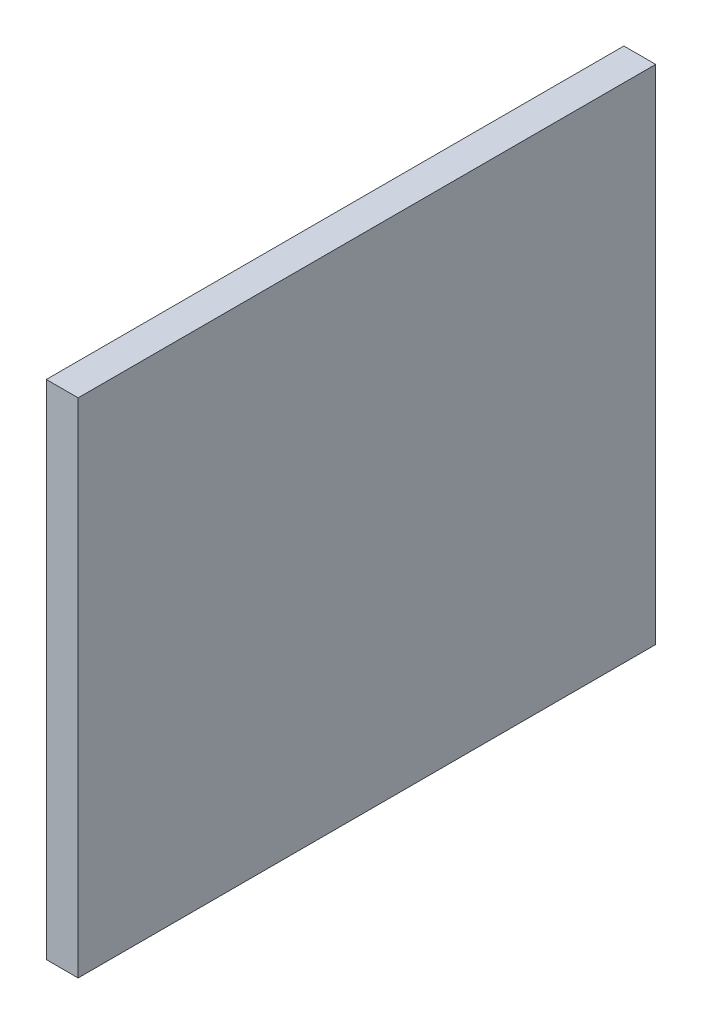
ISO-10303-21;
HEADER;
FILE_DESCRIPTION(('STEP AP214'),'2;1');
FILE_NAME('part.step','',(''),(''),'','','');
FILE_SCHEMA(('AUTOMOTIVE_DESIGN { 1 0 10303 214 1 1 1 1 }'));
ENDSEC;
DATA;
#1=APPLICATION_CONTEXT('core data for automotive mechanical design processes');
#2=APPLICATION_PROTOCOL_DEFINITION('international standard','automotive_design',2000,#1);
#3=PRODUCT_CONTEXT('',#1,'mechanical');
#4=PRODUCT('Part','Part','',(#3));
#5=PRODUCT_RELATED_PRODUCT_CATEGORY('part','',(#4));
#6=PRODUCT_DEFINITION_FORMATION('','',#4);
#7=PRODUCT_DEFINITION_CONTEXT('part definition',#1,'design');
#8=PRODUCT_DEFINITION('design','',#6,#7);
#9=PRODUCT_DEFINITION_SHAPE('','',#8);
#10=(LENGTH_UNIT() NAMED_UNIT(*) SI_UNIT(.MILLI.,.METRE.));
#11=(NAMED_UNIT(*) PLANE_ANGLE_UNIT() SI_UNIT($,.RADIAN.));
#12=(NAMED_UNIT(*) SI_UNIT($,.STERADIAN.) SOLID_ANGLE_UNIT());
#13=UNCERTAINTY_MEASURE_WITH_UNIT(LENGTH_MEASURE(1.E-05),#10,'distance_accuracy_value','');
#14=(GEOMETRIC_REPRESENTATION_CONTEXT(3) GLOBAL_UNCERTAINTY_ASSIGNED_CONTEXT((#13)) GLOBAL_UNIT_ASSIGNED_CONTEXT((#10,
#11,#12)) REPRESENTATION_CONTEXT('',''));
#15=CARTESIAN_POINT('',(0.,0.,0.));
#16=DIRECTION('',(0.,0.,1.));
#17=DIRECTION('',(1.,0.,0.));
#18=AXIS2_PLACEMENT_3D('',#15,#16,#17);
#19=CARTESIAN_POINT('',(7621.97362852035,3360.56913960241,57.6072));
#20=DIRECTION('',(0.,-1.,0.));
#21=DIRECTION('',(0.,0.,-1.));
#22=AXIS2_PLACEMENT_3D('',#19,#20,#21);
#23=PLANE('',#22);
#24=DIRECTION('',(-1.,0.,0.));
#25=VECTOR('',#24,1.);
#26=CARTESIAN_POINT('',(7621.97362852035,3360.56913960241,0.));
#27=LINE('',#26,#25);
#28=CARTESIAN_POINT('',(7625.14862852035,3360.56913960241,0.));
#29=VERTEX_POINT('',#28);
#30=CARTESIAN_POINT('',(7621.97362852035,3360.56913960241,0.));
#31=VERTEX_POINT('',#30);
#32=EDGE_CURVE('E96',#29,#31,#27,.T.);
#33=ORIENTED_EDGE('',*,*,#32,.T.);
#34=DIRECTION('',(0.,0.,-1.));
#35=VECTOR('',#34,1.);
#36=CARTESIAN_POINT('',(7621.97362852035,3360.56913960241,57.6072));
#37=LINE('',#36,#35);
#38=CARTESIAN_POINT('',(7621.97362852035,3360.56913960241,57.6072));
#39=VERTEX_POINT('',#38);
#40=EDGE_CURVE('E11',#39,#31,#37,.T.);
#41=ORIENTED_EDGE('',*,*,#40,.F.);
#42=DIRECTION('',(-1.,0.,0.));
#43=VECTOR('',#42,1.);
#44=CARTESIAN_POINT('',(7621.97362852035,3360.56913960241,57.6072));
#45=LINE('',#44,#43);
#46=CARTESIAN_POINT('',(7625.14862852035,3360.56913960241,57.6072));
#47=VERTEX_POINT('',#46);
#48=EDGE_CURVE('E84',#47,#39,#45,.T.);
#49=ORIENTED_EDGE('',*,*,#48,.F.);
#50=DIRECTION('',(0.,0.,-1.));
#51=VECTOR('',#50,1.);
#52=CARTESIAN_POINT('',(7625.14862852035,3360.56913960241,57.6072));
#53=LINE('',#52,#51);
#54=EDGE_CURVE('E92',#47,#29,#53,.T.);
#55=ORIENTED_EDGE('',*,*,#54,.T.);
#56=EDGE_LOOP('',(#33,#41,#49,#55));
#57=FACE_BOUND('',#56,.T.);
#58=ADVANCED_FACE('F33',(#57),#23,.F.);
#59=CARTESIAN_POINT('',(7621.97362852035,3360.56913960241,57.6072));
#60=DIRECTION('',(1.,0.,0.));
#61=DIRECTION('',(0.,0.,-1.));
#62=AXIS2_PLACEMENT_3D('',#59,#60,#61);
#63=PLANE('',#62);
#64=DIRECTION('',(0.,-1.,0.));
#65=VECTOR('',#64,1.);
#66=CARTESIAN_POINT('',(7621.97362852035,3360.56913960241,0.));
#67=LINE('',#66,#65);
#68=CARTESIAN_POINT('',(7621.97362852035,3310.45493960241,0.));
#69=VERTEX_POINT('',#68);
#70=EDGE_CURVE('E88',#31,#69,#67,.T.);
#71=ORIENTED_EDGE('',*,*,#70,.T.);
#72=DIRECTION('',(0.,0.,-1.));
#73=VECTOR('',#72,1.);
#74=CARTESIAN_POINT('',(7621.97362852035,3310.45493960241,57.6072));
#75=LINE('',#74,#73);
#76=CARTESIAN_POINT('',(7621.97362852035,3310.45493960241,57.6072));
#77=VERTEX_POINT('',#76);
#78=EDGE_CURVE('E41',#77,#69,#75,.T.);
#79=ORIENTED_EDGE('',*,*,#78,.F.);
#80=DIRECTION('',(0.,-1.,0.));
#81=VECTOR('',#80,1.);
#82=CARTESIAN_POINT('',(7621.97362852035,3360.56913960241,57.6072));
#83=LINE('',#82,#81);
#84=EDGE_CURVE('E79',#39,#77,#83,.T.);
#85=ORIENTED_EDGE('',*,*,#84,.F.);
#86=ORIENTED_EDGE('',*,*,#40,.T.);
#87=EDGE_LOOP('',(#71,#79,#85,#86));
#88=FACE_BOUND('',#87,.T.);
#89=ADVANCED_FACE('F87',(#88),#63,.F.);
#90=CARTESIAN_POINT('',(7625.14862852035,3310.45493960241,57.6072));
#91=DIRECTION('',(0.,1.,0.));
#92=DIRECTION('',(0.,0.,1.));
#93=AXIS2_PLACEMENT_3D('',#90,#91,#92);
#94=PLANE('',#93);
#95=DIRECTION('',(1.,0.,0.));
#96=VECTOR('',#95,1.);
#97=CARTESIAN_POINT('',(7625.14862852035,3310.45493960241,0.));
#98=LINE('',#97,#96);
#99=CARTESIAN_POINT('',(7625.14862852035,3310.45493960241,0.));
#100=VERTEX_POINT('',#99);
#101=EDGE_CURVE('E66',#69,#100,#98,.T.);
#102=ORIENTED_EDGE('',*,*,#101,.T.);
#103=DIRECTION('',(0.,0.,-1.));
#104=VECTOR('',#103,1.);
#105=CARTESIAN_POINT('',(7625.14862852035,3310.45493960241,57.6072));
#106=LINE('',#105,#104);
#107=CARTESIAN_POINT('',(7625.14862852035,3310.45493960241,57.6072));
#108=VERTEX_POINT('',#107);
#109=EDGE_CURVE('E89',#108,#100,#106,.T.);
#110=ORIENTED_EDGE('',*,*,#109,.F.);
#111=DIRECTION('',(1.,0.,0.));
#112=VECTOR('',#111,1.);
#113=CARTESIAN_POINT('',(7625.14862852035,3310.45493960241,57.6072));
#114=LINE('',#113,#112);
#115=EDGE_CURVE('E82',#77,#108,#114,.T.);
#116=ORIENTED_EDGE('',*,*,#115,.F.);
#117=ORIENTED_EDGE('',*,*,#78,.T.);
#118=EDGE_LOOP('',(#102,#110,#116,#117));
#119=FACE_BOUND('',#118,.T.);
#120=ADVANCED_FACE('F90',(#119),#94,.F.);
#121=CARTESIAN_POINT('',(7625.14862852035,3360.56913960241,57.6072));
#122=DIRECTION('',(-1.,0.,0.));
#123=DIRECTION('',(0.,0.,1.));
#124=AXIS2_PLACEMENT_3D('',#121,#122,#123);
#125=PLANE('',#124);
#126=DIRECTION('',(0.,1.,0.));
#127=VECTOR('',#126,1.);
#128=CARTESIAN_POINT('',(7625.14862852035,3360.56913960241,0.));
#129=LINE('',#128,#127);
#130=EDGE_CURVE('E72',#100,#29,#129,.T.);
#131=ORIENTED_EDGE('',*,*,#130,.T.);
#132=ORIENTED_EDGE('',*,*,#54,.F.);
#133=DIRECTION('',(0.,1.,0.));
#134=VECTOR('',#133,1.);
#135=CARTESIAN_POINT('',(7625.14862852035,3360.56913960241,57.6072));
#136=LINE('',#135,#134);
#137=EDGE_CURVE('E49',#108,#47,#136,.T.);
#138=ORIENTED_EDGE('',*,*,#137,.F.);
#139=ORIENTED_EDGE('',*,*,#109,.T.);
#140=EDGE_LOOP('',(#131,#132,#138,#139));
#141=FACE_BOUND('',#140,.T.);
#142=ADVANCED_FACE('F103',(#141),#125,.F.);
#143=CARTESIAN_POINT('',(0.,0.,57.6072));
#144=DIRECTION('',(0.,0.,-1.));
#145=DIRECTION('',(-1.,0.,0.));
#146=AXIS2_PLACEMENT_3D('',#143,#144,#145);
#147=PLANE('',#146);
#148=ORIENTED_EDGE('',*,*,#48,.T.);
#149=ORIENTED_EDGE('',*,*,#84,.T.);
#150=ORIENTED_EDGE('',*,*,#115,.T.);
#151=ORIENTED_EDGE('',*,*,#137,.T.);
#152=EDGE_LOOP('',(#148,#149,#150,#151));
#153=FACE_BOUND('',#152,.T.);
#154=ADVANCED_FACE('F80',(#153),#147,.F.);
#155=CARTESIAN_POINT('',(0.,0.,0.));
#156=DIRECTION('',(0.,0.,-1.));
#157=DIRECTION('',(-1.,0.,0.));
#158=AXIS2_PLACEMENT_3D('',#155,#156,#157);
#159=PLANE('',#158);
#160=ORIENTED_EDGE('',*,*,#32,.F.);
#161=ORIENTED_EDGE('',*,*,#130,.F.);
#162=ORIENTED_EDGE('',*,*,#101,.F.);
#163=ORIENTED_EDGE('',*,*,#70,.F.);
#164=EDGE_LOOP('',(#160,#161,#162,#163));
#165=FACE_BOUND('',#164,.T.);
#166=ADVANCED_FACE('F106',(#165),#159,.T.);
#167=CLOSED_SHELL('',(#58,#89,#120,#142,#154,#166));
#168=MANIFOLD_SOLID_BREP('B2',#167);
#169=ADVANCED_BREP_SHAPE_REPRESENTATION('',(#18,#168),#14);
#170=SHAPE_DEFINITION_REPRESENTATION(#9,#169);
ENDSEC;
END-ISO-10303-21;
